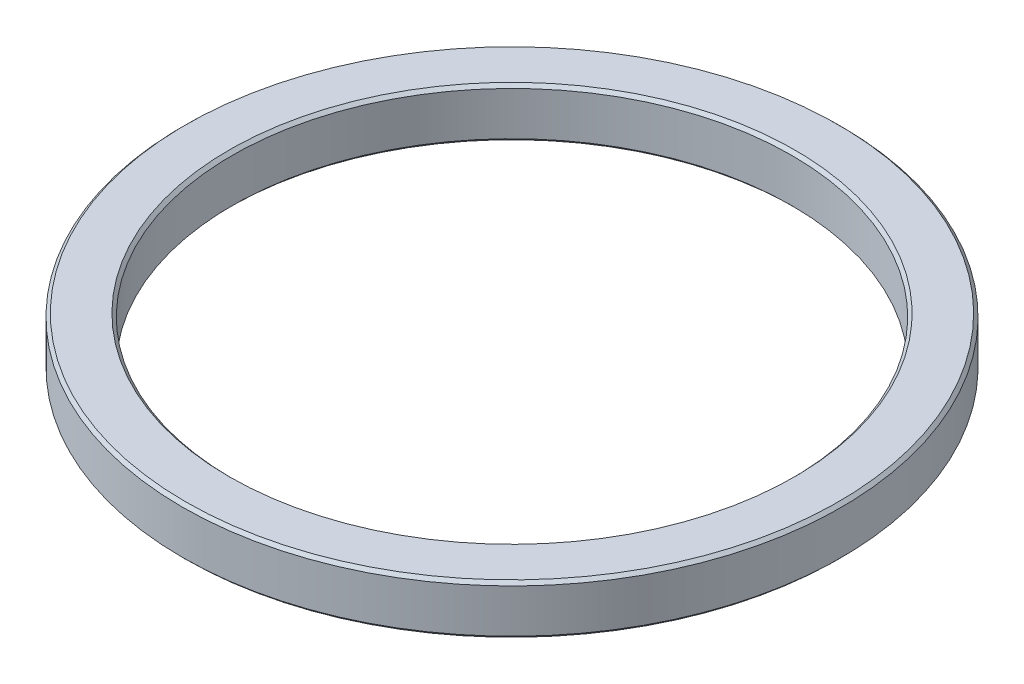
ISO-10303-21;
HEADER;
FILE_DESCRIPTION(('STEP AP214'),'2;1');
FILE_NAME('part.step','',(''),(''),'','','');
FILE_SCHEMA(('AUTOMOTIVE_DESIGN { 1 0 10303 214 1 1 1 1 }'));
ENDSEC;
DATA;
#1=APPLICATION_CONTEXT('core data for automotive mechanical design processes');
#2=APPLICATION_PROTOCOL_DEFINITION('international standard','automotive_design',2000,#1);
#3=PRODUCT_CONTEXT('',#1,'mechanical');
#4=PRODUCT('Part','Part','',(#3));
#5=PRODUCT_RELATED_PRODUCT_CATEGORY('part','',(#4));
#6=PRODUCT_DEFINITION_FORMATION('','',#4);
#7=PRODUCT_DEFINITION_CONTEXT('part definition',#1,'design');
#8=PRODUCT_DEFINITION('design','',#6,#7);
#9=PRODUCT_DEFINITION_SHAPE('','',#8);
#10=(LENGTH_UNIT() NAMED_UNIT(*) SI_UNIT(.MILLI.,.METRE.));
#11=(NAMED_UNIT(*) PLANE_ANGLE_UNIT() SI_UNIT($,.RADIAN.));
#12=(NAMED_UNIT(*) SI_UNIT($,.STERADIAN.) SOLID_ANGLE_UNIT());
#13=UNCERTAINTY_MEASURE_WITH_UNIT(LENGTH_MEASURE(1.E-05),#10,'distance_accuracy_value','');
#14=(GEOMETRIC_REPRESENTATION_CONTEXT(3) GLOBAL_UNCERTAINTY_ASSIGNED_CONTEXT((#13)) GLOBAL_UNIT_ASSIGNED_CONTEXT((#10,
#11,#12)) REPRESENTATION_CONTEXT('',''));
#15=CARTESIAN_POINT('',(0.,0.,0.));
#16=DIRECTION('',(0.,0.,1.));
#17=DIRECTION('',(1.,0.,0.));
#18=AXIS2_PLACEMENT_3D('',#15,#16,#17);
#19=CARTESIAN_POINT('',(0.,4.,0.));
#20=DIRECTION('',(0.,1.,0.));
#21=DIRECTION('',(0.,0.,1.));
#22=AXIS2_PLACEMENT_3D('',#19,#20,#21);
#23=PLANE('',#22);
#24=CARTESIAN_POINT('',(0.,4.,0.));
#25=DIRECTION('',(0.,1.,0.));
#26=DIRECTION('',(0.,0.,1.));
#27=AXIS2_PLACEMENT_3D('',#24,#25,#26);
#28=CIRCLE('',#27,52.5000000000001);
#29=CARTESIAN_POINT('',(0.,4.,52.5000000000001));
#30=VERTEX_POINT('',#29);
#31=EDGE_CURVE('E48',#30,#30,#28,.T.);
#32=ORIENTED_EDGE('',*,*,#31,.T.);
#33=EDGE_LOOP('',(#32));
#34=FACE_BOUND('',#33,.T.);
#35=CARTESIAN_POINT('',(0.,4.,0.));
#36=DIRECTION('',(0.,1.,0.));
#37=DIRECTION('',(0.,0.,1.));
#38=AXIS2_PLACEMENT_3D('',#35,#36,#37);
#39=CIRCLE('',#38,45.5);
#40=CARTESIAN_POINT('',(0.,4.,45.5));
#41=VERTEX_POINT('',#40);
#42=EDGE_CURVE('E52',#41,#41,#39,.F.);
#43=ORIENTED_EDGE('',*,*,#42,.T.);
#44=EDGE_LOOP('',(#43));
#45=FACE_BOUND('',#44,.T.);
#46=ADVANCED_FACE('F36',(#34,#45),#23,.T.);
#47=CARTESIAN_POINT('',(0.,-4.,0.));
#48=DIRECTION('',(0.,1.,0.));
#49=DIRECTION('',(0.,0.,1.));
#50=AXIS2_PLACEMENT_3D('',#47,#48,#49);
#51=PLANE('',#50);
#52=CARTESIAN_POINT('',(0.,-4.,0.));
#53=DIRECTION('',(0.,1.,0.));
#54=DIRECTION('',(0.,0.,1.));
#55=AXIS2_PLACEMENT_3D('',#52,#53,#54);
#56=CIRCLE('',#55,52.5000000000001);
#57=CARTESIAN_POINT('',(0.,-4.,52.5000000000001));
#58=VERTEX_POINT('',#57);
#59=EDGE_CURVE('E57',#58,#58,#56,.F.);
#60=ORIENTED_EDGE('',*,*,#59,.T.);
#61=EDGE_LOOP('',(#60));
#62=FACE_BOUND('',#61,.T.);
#63=CARTESIAN_POINT('',(0.,-4.,0.));
#64=DIRECTION('',(0.,1.,0.));
#65=DIRECTION('',(0.,0.,1.));
#66=AXIS2_PLACEMENT_3D('',#63,#64,#65);
#67=CIRCLE('',#66,45.5);
#68=CARTESIAN_POINT('',(0.,-4.,45.5));
#69=VERTEX_POINT('',#68);
#70=EDGE_CURVE('E60',#69,#69,#67,.T.);
#71=ORIENTED_EDGE('',*,*,#70,.T.);
#72=EDGE_LOOP('',(#71));
#73=FACE_BOUND('',#72,.T.);
#74=ADVANCED_FACE('F82',(#62,#73),#51,.F.);
#75=CARTESIAN_POINT('',(0.,4.,0.));
#76=DIRECTION('',(0.,-1.,0.));
#77=DIRECTION('',(0.,0.,-1.));
#78=AXIS2_PLACEMENT_3D('',#75,#76,#77);
#79=CYLINDRICAL_SURFACE('',#78,53.0000000000001);
#80=CARTESIAN_POINT('',(0.,-3.5,0.));
#81=DIRECTION('',(0.,1.,0.));
#82=DIRECTION('',(0.,0.,1.));
#83=AXIS2_PLACEMENT_3D('',#80,#81,#82);
#84=CIRCLE('',#83,53.0000000000001);
#85=CARTESIAN_POINT('',(0.,-3.5,53.0000000000001));
#86=VERTEX_POINT('',#85);
#87=EDGE_CURVE('E63',#86,#86,#84,.T.);
#88=ORIENTED_EDGE('',*,*,#87,.T.);
#89=EDGE_LOOP('',(#88));
#90=FACE_BOUND('',#89,.T.);
#91=CARTESIAN_POINT('',(0.,3.50000000000001,0.));
#92=DIRECTION('',(0.,1.,0.));
#93=DIRECTION('',(0.,0.,1.));
#94=AXIS2_PLACEMENT_3D('',#91,#92,#93);
#95=CIRCLE('',#94,53.0000000000001);
#96=CARTESIAN_POINT('',(0.,3.50000000000001,53.0000000000001));
#97=VERTEX_POINT('',#96);
#98=EDGE_CURVE('E66',#97,#97,#95,.F.);
#99=ORIENTED_EDGE('',*,*,#98,.T.);
#100=EDGE_LOOP('',(#99));
#101=FACE_BOUND('',#100,.T.);
#102=ADVANCED_FACE('F70',(#90,#101),#79,.T.);
#103=CARTESIAN_POINT('',(0.,4.,0.));
#104=DIRECTION('',(0.,-1.,0.));
#105=DIRECTION('',(0.,0.,-1.));
#106=AXIS2_PLACEMENT_3D('',#103,#104,#105);
#107=CYLINDRICAL_SURFACE('',#106,45.);
#108=CARTESIAN_POINT('',(0.,-3.49999999999999,0.));
#109=DIRECTION('',(0.,1.,0.));
#110=DIRECTION('',(0.,0.,1.));
#111=AXIS2_PLACEMENT_3D('',#108,#109,#110);
#112=CIRCLE('',#111,45.);
#113=CARTESIAN_POINT('',(0.,-3.49999999999999,45.));
#114=VERTEX_POINT('',#113);
#115=EDGE_CURVE('E10',#114,#114,#112,.F.);
#116=ORIENTED_EDGE('',*,*,#115,.T.);
#117=EDGE_LOOP('',(#116));
#118=FACE_BOUND('',#117,.T.);
#119=CARTESIAN_POINT('',(0.,3.50000000000002,0.));
#120=DIRECTION('',(0.,1.,0.));
#121=DIRECTION('',(0.,0.,1.));
#122=AXIS2_PLACEMENT_3D('',#119,#120,#121);
#123=CIRCLE('',#122,45.);
#124=CARTESIAN_POINT('',(0.,3.50000000000002,45.));
#125=VERTEX_POINT('',#124);
#126=EDGE_CURVE('E44',#125,#125,#123,.T.);
#127=ORIENTED_EDGE('',*,*,#126,.T.);
#128=EDGE_LOOP('',(#127));
#129=FACE_BOUND('',#128,.T.);
#130=ADVANCED_FACE('F107',(#118,#129),#107,.F.);
#131=CARTESIAN_POINT('',(0.,-3.5,0.));
#132=DIRECTION('',(0.,1.,0.));
#133=DIRECTION('',(0.,0.,1.));
#134=AXIS2_PLACEMENT_3D('',#131,#132,#133);
#135=CONICAL_SURFACE('',#134,53.0000000000001,0.785398163397448);
#136=ORIENTED_EDGE('',*,*,#59,.F.);
#137=EDGE_LOOP('',(#136));
#138=FACE_BOUND('',#137,.T.);
#139=ORIENTED_EDGE('',*,*,#87,.F.);
#140=EDGE_LOOP('',(#139));
#141=FACE_BOUND('',#140,.T.);
#142=ADVANCED_FACE('F76',(#138,#141),#135,.T.);
#143=CARTESIAN_POINT('',(0.,4.,0.));
#144=DIRECTION('',(0.,-1.,0.));
#145=DIRECTION('',(0.,0.,-1.));
#146=AXIS2_PLACEMENT_3D('',#143,#144,#145);
#147=CONICAL_SURFACE('',#146,52.5000000000001,0.785398163397434);
#148=ORIENTED_EDGE('',*,*,#98,.F.);
#149=EDGE_LOOP('',(#148));
#150=FACE_BOUND('',#149,.T.);
#151=ORIENTED_EDGE('',*,*,#31,.F.);
#152=EDGE_LOOP('',(#151));
#153=FACE_BOUND('',#152,.T.);
#154=ADVANCED_FACE('F72',(#150,#153),#147,.T.);
#155=CARTESIAN_POINT('',(0.,-4.,0.));
#156=DIRECTION('',(0.,-1.,0.));
#157=DIRECTION('',(0.,0.,-1.));
#158=AXIS2_PLACEMENT_3D('',#155,#156,#157);
#159=CONICAL_SURFACE('',#158,45.5,0.785398163397448);
#160=ORIENTED_EDGE('',*,*,#115,.F.);
#161=EDGE_LOOP('',(#160));
#162=FACE_BOUND('',#161,.T.);
#163=ORIENTED_EDGE('',*,*,#70,.F.);
#164=EDGE_LOOP('',(#163));
#165=FACE_BOUND('',#164,.T.);
#166=ADVANCED_FACE('F75',(#162,#165),#159,.F.);
#167=CARTESIAN_POINT('',(0.,3.50000000000002,0.));
#168=DIRECTION('',(0.,1.,0.));
#169=DIRECTION('',(0.,0.,1.));
#170=AXIS2_PLACEMENT_3D('',#167,#168,#169);
#171=CONICAL_SURFACE('',#170,45.,0.785398163397462);
#172=ORIENTED_EDGE('',*,*,#42,.F.);
#173=EDGE_LOOP('',(#172));
#174=FACE_BOUND('',#173,.T.);
#175=ORIENTED_EDGE('',*,*,#126,.F.);
#176=EDGE_LOOP('',(#175));
#177=FACE_BOUND('',#176,.T.);
#178=ADVANCED_FACE('F39',(#174,#177),#171,.F.);
#179=CLOSED_SHELL('',(#46,#74,#102,#130,#142,#154,#166,#178));
#180=MANIFOLD_SOLID_BREP('B2',#179);
#181=ADVANCED_BREP_SHAPE_REPRESENTATION('',(#18,#180),#14);
#182=SHAPE_DEFINITION_REPRESENTATION(#9,#181);
ENDSEC;
END-ISO-10303-21;
